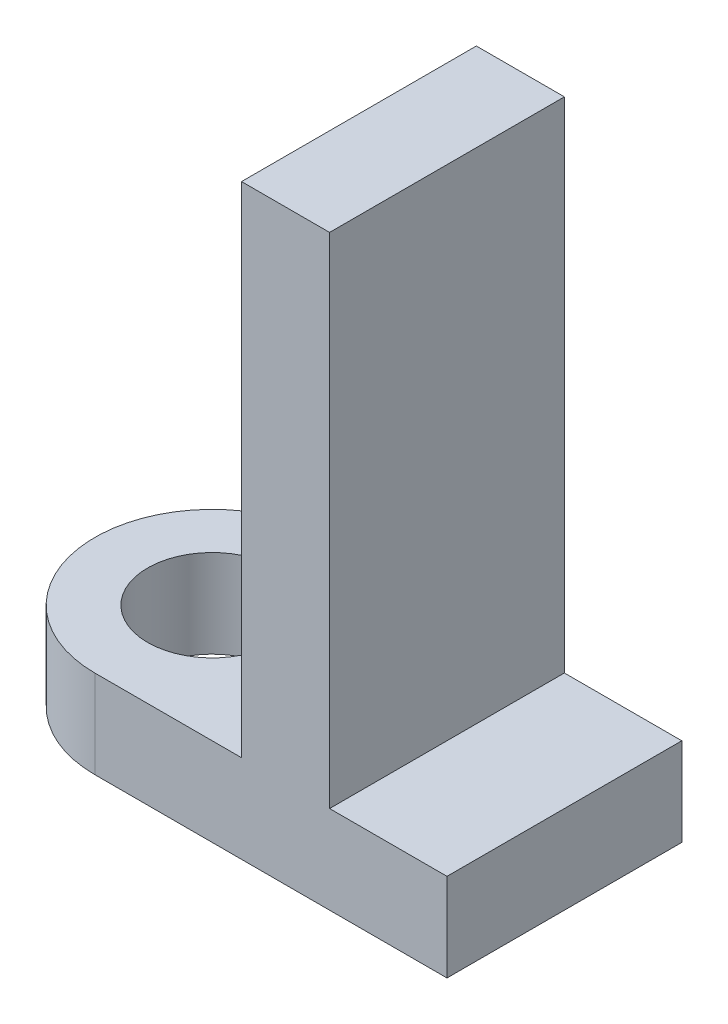
ISO-10303-21;
HEADER;
FILE_DESCRIPTION(('STEP AP214'),'2;1');
FILE_NAME('part.step','',(''),(''),'','','');
FILE_SCHEMA(('AUTOMOTIVE_DESIGN { 1 0 10303 214 1 1 1 1 }'));
ENDSEC;
DATA;
#1=APPLICATION_CONTEXT('core data for automotive mechanical design processes');
#2=APPLICATION_PROTOCOL_DEFINITION('international standard','automotive_design',2000,#1);
#3=PRODUCT_CONTEXT('',#1,'mechanical');
#4=PRODUCT('Part','Part','',(#3));
#5=PRODUCT_RELATED_PRODUCT_CATEGORY('part','',(#4));
#6=PRODUCT_DEFINITION_FORMATION('','',#4);
#7=PRODUCT_DEFINITION_CONTEXT('part definition',#1,'design');
#8=PRODUCT_DEFINITION('design','',#6,#7);
#9=PRODUCT_DEFINITION_SHAPE('','',#8);
#10=(LENGTH_UNIT() NAMED_UNIT(*) SI_UNIT(.MILLI.,.METRE.));
#11=(NAMED_UNIT(*) PLANE_ANGLE_UNIT() SI_UNIT($,.RADIAN.));
#12=(NAMED_UNIT(*) SI_UNIT($,.STERADIAN.) SOLID_ANGLE_UNIT());
#13=UNCERTAINTY_MEASURE_WITH_UNIT(LENGTH_MEASURE(1.E-05),#10,'distance_accuracy_value','');
#14=(GEOMETRIC_REPRESENTATION_CONTEXT(3) GLOBAL_UNCERTAINTY_ASSIGNED_CONTEXT((#13)) GLOBAL_UNIT_ASSIGNED_CONTEXT((#10,
#11,#12)) REPRESENTATION_CONTEXT('',''));
#15=CARTESIAN_POINT('',(0.,0.,0.));
#16=DIRECTION('',(0.,0.,1.));
#17=DIRECTION('',(1.,0.,0.));
#18=AXIS2_PLACEMENT_3D('',#15,#16,#17);
#19=CARTESIAN_POINT('',(-45.0319378324809,150.,-27.9815162697617));
#20=DIRECTION('',(0.,1.,0.));
#21=DIRECTION('',(0.,0.,1.));
#22=AXIS2_PLACEMENT_3D('',#19,#20,#21);
#23=PLANE('',#22);
#24=DIRECTION('',(0.,0.,-1.));
#25=VECTOR('',#24,1.);
#26=CARTESIAN_POINT('',(354.968062167519,150.,-27.9815162697618));
#27=LINE('',#26,#25);
#28=CARTESIAN_POINT('',(354.968062167519,150.,172.018483730238));
#29=VERTEX_POINT('',#28);
#30=CARTESIAN_POINT('',(354.968062167519,150.,-227.981516269762));
#31=VERTEX_POINT('',#30);
#32=EDGE_CURVE('E126',#29,#31,#27,.T.);
#33=ORIENTED_EDGE('',*,*,#32,.F.);
#34=DIRECTION('',(1.,0.,0.));
#35=VECTOR('',#34,1.);
#36=CARTESIAN_POINT('',(-45.0319378324809,150.,172.018483730238));
#37=LINE('',#36,#35);
#38=CARTESIAN_POINT('',(554.968062167519,150.,172.018483730238));
#39=VERTEX_POINT('',#38);
#40=EDGE_CURVE('E168',#29,#39,#37,.T.);
#41=ORIENTED_EDGE('',*,*,#40,.T.);
#42=DIRECTION('',(0.,0.,-1.));
#43=VECTOR('',#42,1.);
#44=CARTESIAN_POINT('',(554.968062167519,150.,-227.981516269762));
#45=LINE('',#44,#43);
#46=CARTESIAN_POINT('',(554.968062167519,150.,-227.981516269762));
#47=VERTEX_POINT('',#46);
#48=EDGE_CURVE('E173',#39,#47,#45,.T.);
#49=ORIENTED_EDGE('',*,*,#48,.T.);
#50=DIRECTION('',(-1.,0.,0.));
#51=VECTOR('',#50,1.);
#52=CARTESIAN_POINT('',(-45.0319378324809,150.,-227.981516269762));
#53=LINE('',#52,#51);
#54=EDGE_CURVE('E69',#47,#31,#53,.T.);
#55=ORIENTED_EDGE('',*,*,#54,.T.);
#56=EDGE_LOOP('',(#33,#41,#49,#55));
#57=FACE_BOUND('',#56,.T.);
#58=ADVANCED_FACE('F45',(#57),#23,.T.);
#59=DIRECTION('',(0.,0.,1.));
#60=VECTOR('',#59,1.);
#61=CARTESIAN_POINT('',(204.968062167519,150.,-227.981516269762));
#62=LINE('',#61,#60);
#63=CARTESIAN_POINT('',(204.968062167519,150.,-227.981516269762));
#64=VERTEX_POINT('',#63);
#65=CARTESIAN_POINT('',(204.968062167519,150.,172.018483730238));
#66=VERTEX_POINT('',#65);
#67=EDGE_CURVE('E61',#64,#66,#62,.T.);
#68=ORIENTED_EDGE('',*,*,#67,.F.);
#69=CARTESIAN_POINT('',(-45.0319378324809,150.,-227.981516269762));
#70=VERTEX_POINT('',#69);
#71=EDGE_CURVE('E176',#64,#70,#53,.T.);
#72=ORIENTED_EDGE('',*,*,#71,.T.);
#73=CARTESIAN_POINT('',(-45.0319378324809,150.,-27.9815162697617));
#74=DIRECTION('',(0.,1.,0.));
#75=DIRECTION('',(0.,0.,1.));
#76=AXIS2_PLACEMENT_3D('',#73,#74,#75);
#77=CIRCLE('',#76,200.);
#78=CARTESIAN_POINT('',(-45.0319378324809,150.,172.018483730238));
#79=VERTEX_POINT('',#78);
#80=EDGE_CURVE('E164',#70,#79,#77,.T.);
#81=ORIENTED_EDGE('',*,*,#80,.T.);
#82=EDGE_CURVE('E170',#79,#66,#37,.T.);
#83=ORIENTED_EDGE('',*,*,#82,.T.);
#84=EDGE_LOOP('',(#68,#72,#81,#83));
#85=FACE_BOUND('',#84,.T.);
#86=CARTESIAN_POINT('',(-45.0319378324809,150.,-27.9815162697617));
#87=DIRECTION('',(0.,1.,0.));
#88=DIRECTION('',(0.,0.,1.));
#89=AXIS2_PLACEMENT_3D('',#86,#87,#88);
#90=CIRCLE('',#89,110.);
#91=CARTESIAN_POINT('',(-45.0319378324809,150.,82.0184837302382));
#92=VERTEX_POINT('',#91);
#93=EDGE_CURVE('E156',#92,#92,#90,.T.);
#94=ORIENTED_EDGE('',*,*,#93,.F.);
#95=EDGE_LOOP('',(#94));
#96=FACE_BOUND('',#95,.T.);
#97=ADVANCED_FACE('F216',(#85,#96),#23,.T.);
#98=CARTESIAN_POINT('',(-45.0319378324809,0.,-27.9815162697617));
#99=DIRECTION('',(0.,1.,0.));
#100=DIRECTION('',(0.,0.,1.));
#101=AXIS2_PLACEMENT_3D('',#98,#99,#100);
#102=PLANE('',#101);
#103=CARTESIAN_POINT('',(-45.0319378324809,0.,-27.9815162697617));
#104=DIRECTION('',(0.,1.,0.));
#105=DIRECTION('',(0.,0.,1.));
#106=AXIS2_PLACEMENT_3D('',#103,#104,#105);
#107=CIRCLE('',#106,200.);
#108=CARTESIAN_POINT('',(-45.0319378324809,0.,-227.981516269762));
#109=VERTEX_POINT('',#108);
#110=CARTESIAN_POINT('',(-45.0319378324809,0.,172.018483730238));
#111=VERTEX_POINT('',#110);
#112=EDGE_CURVE('E160',#109,#111,#107,.T.);
#113=ORIENTED_EDGE('',*,*,#112,.F.);
#114=DIRECTION('',(-1.,0.,0.));
#115=VECTOR('',#114,1.);
#116=CARTESIAN_POINT('',(-45.0319378324809,0.,-227.981516269762));
#117=LINE('',#116,#115);
#118=CARTESIAN_POINT('',(554.968062167519,0.,-227.981516269762));
#119=VERTEX_POINT('',#118);
#120=EDGE_CURVE('E169',#119,#109,#117,.T.);
#121=ORIENTED_EDGE('',*,*,#120,.F.);
#122=DIRECTION('',(0.,0.,-1.));
#123=VECTOR('',#122,1.);
#124=CARTESIAN_POINT('',(554.968062167519,0.,-227.981516269762));
#125=LINE('',#124,#123);
#126=CARTESIAN_POINT('',(554.968062167519,0.,172.018483730238));
#127=VERTEX_POINT('',#126);
#128=EDGE_CURVE('E186',#127,#119,#125,.T.);
#129=ORIENTED_EDGE('',*,*,#128,.F.);
#130=DIRECTION('',(1.,0.,0.));
#131=VECTOR('',#130,1.);
#132=CARTESIAN_POINT('',(-45.0319378324809,0.,172.018483730238));
#133=LINE('',#132,#131);
#134=EDGE_CURVE('E183',#111,#127,#133,.T.);
#135=ORIENTED_EDGE('',*,*,#134,.F.);
#136=EDGE_LOOP('',(#113,#121,#129,#135));
#137=FACE_BOUND('',#136,.T.);
#138=CARTESIAN_POINT('',(-45.0319378324809,0.,-27.9815162697617));
#139=DIRECTION('',(0.,1.,0.));
#140=DIRECTION('',(0.,0.,1.));
#141=AXIS2_PLACEMENT_3D('',#138,#139,#140);
#142=CIRCLE('',#141,110.);
#143=CARTESIAN_POINT('',(-45.0319378324809,0.,82.0184837302382));
#144=VERTEX_POINT('',#143);
#145=EDGE_CURVE('E129',#144,#144,#142,.T.);
#146=ORIENTED_EDGE('',*,*,#145,.T.);
#147=EDGE_LOOP('',(#146));
#148=FACE_BOUND('',#147,.T.);
#149=ADVANCED_FACE('F210',(#137,#148),#102,.F.);
#150=CARTESIAN_POINT('',(-45.0319378324809,150.,-27.9815162697617));
#151=DIRECTION('',(0.,-1.,0.));
#152=DIRECTION('',(0.,0.,-1.));
#153=AXIS2_PLACEMENT_3D('',#150,#151,#152);
#154=CYLINDRICAL_SURFACE('',#153,200.);
#155=ORIENTED_EDGE('',*,*,#112,.T.);
#156=DIRECTION('',(0.,-1.,0.));
#157=VECTOR('',#156,1.);
#158=CARTESIAN_POINT('',(-45.0319378324809,150.,172.018483730238));
#159=LINE('',#158,#157);
#160=EDGE_CURVE('E11',#79,#111,#159,.T.);
#161=ORIENTED_EDGE('',*,*,#160,.F.);
#162=ORIENTED_EDGE('',*,*,#80,.F.);
#163=DIRECTION('',(0.,-1.,0.));
#164=VECTOR('',#163,1.);
#165=CARTESIAN_POINT('',(-45.0319378324809,150.,-227.981516269762));
#166=LINE('',#165,#164);
#167=EDGE_CURVE('E179',#70,#109,#166,.T.);
#168=ORIENTED_EDGE('',*,*,#167,.T.);
#169=EDGE_LOOP('',(#155,#161,#162,#168));
#170=FACE_BOUND('',#169,.T.);
#171=ADVANCED_FACE('F47',(#170),#154,.T.);
#172=CARTESIAN_POINT('',(-45.0319378324809,150.,172.018483730238));
#173=DIRECTION('',(0.,0.,-1.));
#174=DIRECTION('',(-1.,0.,0.));
#175=AXIS2_PLACEMENT_3D('',#172,#173,#174);
#176=PLANE('',#175);
#177=ORIENTED_EDGE('',*,*,#134,.T.);
#178=DIRECTION('',(0.,-1.,0.));
#179=VECTOR('',#178,1.);
#180=CARTESIAN_POINT('',(554.968062167519,150.,172.018483730238));
#181=LINE('',#180,#179);
#182=EDGE_CURVE('E54',#39,#127,#181,.T.);
#183=ORIENTED_EDGE('',*,*,#182,.F.);
#184=ORIENTED_EDGE('',*,*,#40,.F.);
#185=DIRECTION('',(0.,-1.,0.));
#186=VECTOR('',#185,1.);
#187=CARTESIAN_POINT('',(354.968062167519,1000.,172.018483730238));
#188=LINE('',#187,#186);
#189=CARTESIAN_POINT('',(354.968062167519,1000.,172.018483730238));
#190=VERTEX_POINT('',#189);
#191=EDGE_CURVE('E143',#190,#29,#188,.T.);
#192=ORIENTED_EDGE('',*,*,#191,.F.);
#193=DIRECTION('',(1.,0.,0.));
#194=VECTOR('',#193,1.);
#195=CARTESIAN_POINT('',(204.968062167519,1000.,172.018483730238));
#196=LINE('',#195,#194);
#197=CARTESIAN_POINT('',(204.968062167519,1000.,172.018483730238));
#198=VERTEX_POINT('',#197);
#199=EDGE_CURVE('E117',#198,#190,#196,.T.);
#200=ORIENTED_EDGE('',*,*,#199,.F.);
#201=DIRECTION('',(0.,-1.,0.));
#202=VECTOR('',#201,1.);
#203=CARTESIAN_POINT('',(204.968062167519,1000.,172.018483730238));
#204=LINE('',#203,#202);
#205=EDGE_CURVE('E150',#198,#66,#204,.T.);
#206=ORIENTED_EDGE('',*,*,#205,.T.);
#207=ORIENTED_EDGE('',*,*,#82,.F.);
#208=ORIENTED_EDGE('',*,*,#160,.T.);
#209=EDGE_LOOP('',(#177,#183,#184,#192,#200,#206,#207,#208));
#210=FACE_BOUND('',#209,.T.);
#211=ADVANCED_FACE('F220',(#210),#176,.F.);
#212=CARTESIAN_POINT('',(554.968062167519,150.,-227.981516269762));
#213=DIRECTION('',(-1.,0.,0.));
#214=DIRECTION('',(0.,0.,1.));
#215=AXIS2_PLACEMENT_3D('',#212,#213,#214);
#216=PLANE('',#215);
#217=ORIENTED_EDGE('',*,*,#128,.T.);
#218=DIRECTION('',(0.,-1.,0.));
#219=VECTOR('',#218,1.);
#220=CARTESIAN_POINT('',(554.968062167519,150.,-227.981516269762));
#221=LINE('',#220,#219);
#222=EDGE_CURVE('E194',#47,#119,#221,.T.);
#223=ORIENTED_EDGE('',*,*,#222,.F.);
#224=ORIENTED_EDGE('',*,*,#48,.F.);
#225=ORIENTED_EDGE('',*,*,#182,.T.);
#226=EDGE_LOOP('',(#217,#223,#224,#225));
#227=FACE_BOUND('',#226,.T.);
#228=ADVANCED_FACE('F203',(#227),#216,.F.);
#229=CARTESIAN_POINT('',(-45.0319378324809,150.,-227.981516269762));
#230=DIRECTION('',(0.,0.,1.));
#231=DIRECTION('',(1.,0.,0.));
#232=AXIS2_PLACEMENT_3D('',#229,#230,#231);
#233=PLANE('',#232);
#234=ORIENTED_EDGE('',*,*,#120,.T.);
#235=ORIENTED_EDGE('',*,*,#167,.F.);
#236=ORIENTED_EDGE('',*,*,#71,.F.);
#237=DIRECTION('',(0.,-1.,0.));
#238=VECTOR('',#237,1.);
#239=CARTESIAN_POINT('',(204.968062167519,1000.,-227.981516269762));
#240=LINE('',#239,#238);
#241=CARTESIAN_POINT('',(204.968062167519,1000.,-227.981516269762));
#242=VERTEX_POINT('',#241);
#243=EDGE_CURVE('E130',#242,#64,#240,.T.);
#244=ORIENTED_EDGE('',*,*,#243,.F.);
#245=DIRECTION('',(-1.,0.,0.));
#246=VECTOR('',#245,1.);
#247=CARTESIAN_POINT('',(354.968062167519,1000.,-227.981516269762));
#248=LINE('',#247,#246);
#249=CARTESIAN_POINT('',(354.968062167519,1000.,-227.981516269762));
#250=VERTEX_POINT('',#249);
#251=EDGE_CURVE('E114',#250,#242,#248,.T.);
#252=ORIENTED_EDGE('',*,*,#251,.F.);
#253=DIRECTION('',(0.,-1.,0.));
#254=VECTOR('',#253,1.);
#255=CARTESIAN_POINT('',(354.968062167519,1000.,-227.981516269762));
#256=LINE('',#255,#254);
#257=EDGE_CURVE('E124',#250,#31,#256,.T.);
#258=ORIENTED_EDGE('',*,*,#257,.T.);
#259=ORIENTED_EDGE('',*,*,#54,.F.);
#260=ORIENTED_EDGE('',*,*,#222,.T.);
#261=EDGE_LOOP('',(#234,#235,#236,#244,#252,#258,#259,#260));
#262=FACE_BOUND('',#261,.T.);
#263=ADVANCED_FACE('F132',(#262),#233,.F.);
#264=CARTESIAN_POINT('',(-45.0319378324809,150.,-27.9815162697617));
#265=DIRECTION('',(0.,-1.,0.));
#266=DIRECTION('',(0.,0.,-1.));
#267=AXIS2_PLACEMENT_3D('',#264,#265,#266);
#268=CYLINDRICAL_SURFACE('',#267,110.);
#269=ORIENTED_EDGE('',*,*,#93,.T.);
#270=EDGE_LOOP('',(#269));
#271=FACE_BOUND('',#270,.T.);
#272=ORIENTED_EDGE('',*,*,#145,.F.);
#273=EDGE_LOOP('',(#272));
#274=FACE_BOUND('',#273,.T.);
#275=ADVANCED_FACE('F231',(#271,#274),#268,.F.);
#276=CARTESIAN_POINT('',(354.968062167519,1000.,-27.9815162697618));
#277=DIRECTION('',(-1.,0.,0.));
#278=DIRECTION('',(0.,0.,1.));
#279=AXIS2_PLACEMENT_3D('',#276,#277,#278);
#280=PLANE('',#279);
#281=ORIENTED_EDGE('',*,*,#32,.T.);
#282=ORIENTED_EDGE('',*,*,#257,.F.);
#283=DIRECTION('',(0.,0.,-1.));
#284=VECTOR('',#283,1.);
#285=CARTESIAN_POINT('',(354.968062167519,1000.,172.018483730238));
#286=LINE('',#285,#284);
#287=EDGE_CURVE('E110',#190,#250,#286,.T.);
#288=ORIENTED_EDGE('',*,*,#287,.F.);
#289=ORIENTED_EDGE('',*,*,#191,.T.);
#290=EDGE_LOOP('',(#281,#282,#288,#289));
#291=FACE_BOUND('',#290,.T.);
#292=ADVANCED_FACE('F125',(#291),#280,.F.);
#293=CARTESIAN_POINT('',(204.968062167519,1000.,-227.981516269762));
#294=DIRECTION('',(1.,0.,0.));
#295=DIRECTION('',(0.,0.,-1.));
#296=AXIS2_PLACEMENT_3D('',#293,#294,#295);
#297=PLANE('',#296);
#298=ORIENTED_EDGE('',*,*,#67,.T.);
#299=ORIENTED_EDGE('',*,*,#205,.F.);
#300=DIRECTION('',(0.,0.,1.));
#301=VECTOR('',#300,1.);
#302=CARTESIAN_POINT('',(204.968062167519,1000.,-227.981516269762));
#303=LINE('',#302,#301);
#304=EDGE_CURVE('E136',#242,#198,#303,.T.);
#305=ORIENTED_EDGE('',*,*,#304,.F.);
#306=ORIENTED_EDGE('',*,*,#243,.T.);
#307=EDGE_LOOP('',(#298,#299,#305,#306));
#308=FACE_BOUND('',#307,.T.);
#309=ADVANCED_FACE('F223',(#308),#297,.F.);
#310=CARTESIAN_POINT('',(0.,1000.,0.));
#311=DIRECTION('',(0.,1.,0.));
#312=DIRECTION('',(0.,0.,1.));
#313=AXIS2_PLACEMENT_3D('',#310,#311,#312);
#314=PLANE('',#313);
#315=ORIENTED_EDGE('',*,*,#287,.T.);
#316=ORIENTED_EDGE('',*,*,#251,.T.);
#317=ORIENTED_EDGE('',*,*,#304,.T.);
#318=ORIENTED_EDGE('',*,*,#199,.T.);
#319=EDGE_LOOP('',(#315,#316,#317,#318));
#320=FACE_BOUND('',#319,.T.);
#321=ADVANCED_FACE('F112',(#320),#314,.T.);
#322=CLOSED_SHELL('',(#58,#97,#149,#171,#211,#228,#263,#275,#292,#309,#321));
#323=MANIFOLD_SOLID_BREP('B2',#322);
#324=ADVANCED_BREP_SHAPE_REPRESENTATION('',(#18,#323),#14);
#325=SHAPE_DEFINITION_REPRESENTATION(#9,#324);
ENDSEC;
END-ISO-10303-21;
